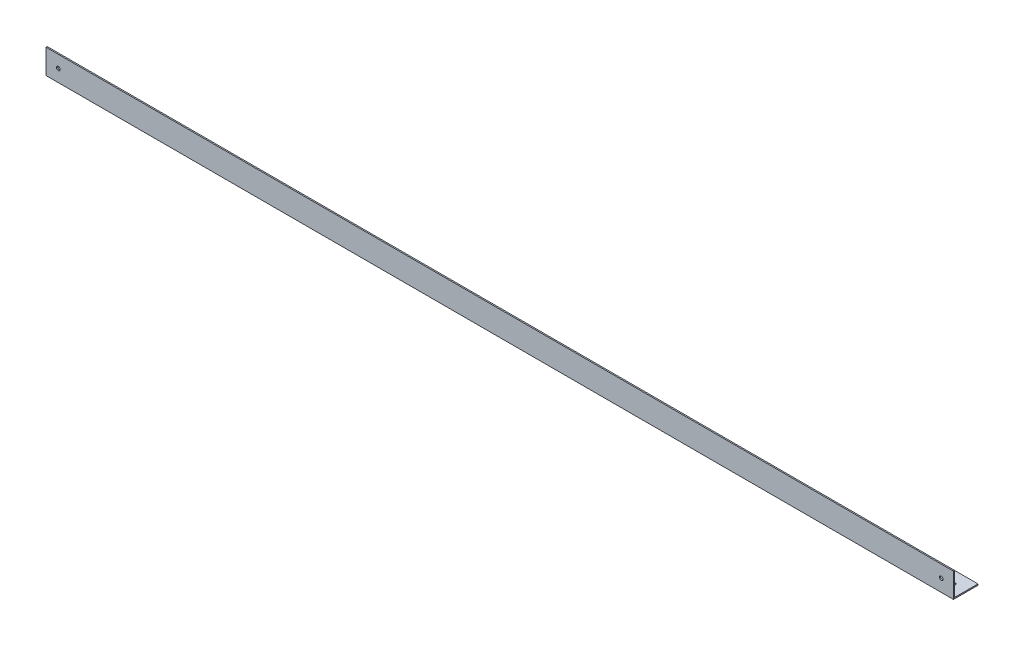
ISO-10303-21;
HEADER;
FILE_DESCRIPTION(('STEP AP214'),'2;1');
FILE_NAME('part.step','',(''),(''),'','','');
FILE_SCHEMA(('AUTOMOTIVE_DESIGN { 1 0 10303 214 1 1 1 1 }'));
ENDSEC;
DATA;
#1=APPLICATION_CONTEXT('core data for automotive mechanical design processes');
#2=APPLICATION_PROTOCOL_DEFINITION('international standard','automotive_design',2000,#1);
#3=PRODUCT_CONTEXT('',#1,'mechanical');
#4=PRODUCT('Part','Part','',(#3));
#5=PRODUCT_RELATED_PRODUCT_CATEGORY('part','',(#4));
#6=PRODUCT_DEFINITION_FORMATION('','',#4);
#7=PRODUCT_DEFINITION_CONTEXT('part definition',#1,'design');
#8=PRODUCT_DEFINITION('design','',#6,#7);
#9=PRODUCT_DEFINITION_SHAPE('','',#8);
#10=(LENGTH_UNIT() NAMED_UNIT(*) SI_UNIT(.MILLI.,.METRE.));
#11=(NAMED_UNIT(*) PLANE_ANGLE_UNIT() SI_UNIT($,.RADIAN.));
#12=(NAMED_UNIT(*) SI_UNIT($,.STERADIAN.) SOLID_ANGLE_UNIT());
#13=UNCERTAINTY_MEASURE_WITH_UNIT(LENGTH_MEASURE(1.E-05),#10,'distance_accuracy_value','');
#14=(GEOMETRIC_REPRESENTATION_CONTEXT(3) GLOBAL_UNCERTAINTY_ASSIGNED_CONTEXT((#13)) GLOBAL_UNIT_ASSIGNED_CONTEXT((#10,
#11,#12)) REPRESENTATION_CONTEXT('',''));
#15=CARTESIAN_POINT('',(0.,0.,0.));
#16=DIRECTION('',(0.,0.,1.));
#17=DIRECTION('',(1.,0.,0.));
#18=AXIS2_PLACEMENT_3D('',#15,#16,#17);
#19=CARTESIAN_POINT('',(740.,0.,-20.));
#20=DIRECTION('',(0.,1.,0.));
#21=DIRECTION('',(0.,0.,1.));
#22=AXIS2_PLACEMENT_3D('',#19,#20,#21);
#23=PLANE('',#22);
#24=CARTESIAN_POINT('',(730.,0.,-10.));
#25=DIRECTION('',(0.,-1.,0.));
#26=DIRECTION('',(0.,0.,-1.));
#27=AXIS2_PLACEMENT_3D('',#24,#25,#26);
#28=CIRCLE('',#27,1.49999999999997);
#29=CARTESIAN_POINT('',(730.,0.,-11.5));
#30=VERTEX_POINT('',#29);
#31=EDGE_CURVE('E169',#30,#30,#28,.T.);
#32=ORIENTED_EDGE('',*,*,#31,.F.);
#33=EDGE_LOOP('',(#32));
#34=FACE_BOUND('',#33,.T.);
#35=CARTESIAN_POINT('',(10.,0.,-10.));
#36=DIRECTION('',(0.,-1.,0.));
#37=DIRECTION('',(0.,0.,-1.));
#38=AXIS2_PLACEMENT_3D('',#35,#36,#37);
#39=CIRCLE('',#38,1.5);
#40=CARTESIAN_POINT('',(10.,0.,-11.5));
#41=VERTEX_POINT('',#40);
#42=EDGE_CURVE('E172',#41,#41,#39,.T.);
#43=ORIENTED_EDGE('',*,*,#42,.F.);
#44=EDGE_LOOP('',(#43));
#45=FACE_BOUND('',#44,.T.);
#46=DIRECTION('',(0.,0.,-1.));
#47=VECTOR('',#46,1.);
#48=CARTESIAN_POINT('',(0.,0.,-20.));
#49=LINE('',#48,#47);
#50=CARTESIAN_POINT('',(0.,0.,0.));
#51=VERTEX_POINT('',#50);
#52=CARTESIAN_POINT('',(0.,0.,-20.));
#53=VERTEX_POINT('',#52);
#54=EDGE_CURVE('E119',#51,#53,#49,.T.);
#55=ORIENTED_EDGE('',*,*,#54,.T.);
#56=DIRECTION('',(-1.,0.,0.));
#57=VECTOR('',#56,1.);
#58=CARTESIAN_POINT('',(740.,0.,-20.));
#59=LINE('',#58,#57);
#60=CARTESIAN_POINT('',(740.,0.,-20.));
#61=VERTEX_POINT('',#60);
#62=EDGE_CURVE('E11',#61,#53,#59,.T.);
#63=ORIENTED_EDGE('',*,*,#62,.F.);
#64=DIRECTION('',(0.,0.,-1.));
#65=VECTOR('',#64,1.);
#66=CARTESIAN_POINT('',(740.,0.,-20.));
#67=LINE('',#66,#65);
#68=CARTESIAN_POINT('',(740.,0.,0.));
#69=VERTEX_POINT('',#68);
#70=EDGE_CURVE('E130',#69,#61,#67,.T.);
#71=ORIENTED_EDGE('',*,*,#70,.F.);
#72=DIRECTION('',(-1.,0.,0.));
#73=VECTOR('',#72,1.);
#74=CARTESIAN_POINT('',(740.,0.,0.));
#75=LINE('',#74,#73);
#76=EDGE_CURVE('E115',#69,#51,#75,.T.);
#77=ORIENTED_EDGE('',*,*,#76,.T.);
#78=EDGE_LOOP('',(#55,#63,#71,#77));
#79=FACE_BOUND('',#78,.T.);
#80=ADVANCED_FACE('F35',(#34,#45,#79),#23,.F.);
#81=CARTESIAN_POINT('',(740.,0.999999999999998,-20.));
#82=DIRECTION('',(0.,0.,1.));
#83=DIRECTION('',(0.,-1.,0.));
#84=AXIS2_PLACEMENT_3D('',#81,#82,#83);
#85=PLANE('',#84);
#86=DIRECTION('',(0.,1.,0.));
#87=VECTOR('',#86,1.);
#88=CARTESIAN_POINT('',(0.,0.999999999999998,-20.));
#89=LINE('',#88,#87);
#90=CARTESIAN_POINT('',(0.,0.999999999999998,-20.));
#91=VERTEX_POINT('',#90);
#92=EDGE_CURVE('E122',#53,#91,#89,.T.);
#93=ORIENTED_EDGE('',*,*,#92,.T.);
#94=DIRECTION('',(-1.,0.,0.));
#95=VECTOR('',#94,1.);
#96=CARTESIAN_POINT('',(740.,0.999999999999998,-20.));
#97=LINE('',#96,#95);
#98=CARTESIAN_POINT('',(740.,0.999999999999998,-20.));
#99=VERTEX_POINT('',#98);
#100=EDGE_CURVE('E43',#99,#91,#97,.T.);
#101=ORIENTED_EDGE('',*,*,#100,.F.);
#102=DIRECTION('',(0.,1.,0.));
#103=VECTOR('',#102,1.);
#104=CARTESIAN_POINT('',(740.,0.999999999999998,-20.));
#105=LINE('',#104,#103);
#106=EDGE_CURVE('E88',#61,#99,#105,.T.);
#107=ORIENTED_EDGE('',*,*,#106,.F.);
#108=ORIENTED_EDGE('',*,*,#62,.T.);
#109=EDGE_LOOP('',(#93,#101,#107,#108));
#110=FACE_BOUND('',#109,.T.);
#111=ADVANCED_FACE('F159',(#110),#85,.F.);
#112=CARTESIAN_POINT('',(740.,0.999999999999997,-1.));
#113=DIRECTION('',(0.,-1.,0.));
#114=DIRECTION('',(0.,0.,-1.));
#115=AXIS2_PLACEMENT_3D('',#112,#113,#114);
#116=PLANE('',#115);
#117=CARTESIAN_POINT('',(730.,0.999999999999997,-10.));
#118=DIRECTION('',(0.,-1.,0.));
#119=DIRECTION('',(0.,0.,-1.));
#120=AXIS2_PLACEMENT_3D('',#117,#118,#119);
#121=CIRCLE('',#120,1.49999999999997);
#122=CARTESIAN_POINT('',(730.,0.999999999999997,-11.5));
#123=VERTEX_POINT('',#122);
#124=EDGE_CURVE('E175',#123,#123,#121,.F.);
#125=ORIENTED_EDGE('',*,*,#124,.F.);
#126=EDGE_LOOP('',(#125));
#127=FACE_BOUND('',#126,.T.);
#128=CARTESIAN_POINT('',(10.,0.999999999999997,-10.));
#129=DIRECTION('',(0.,-1.,0.));
#130=DIRECTION('',(0.,0.,-1.));
#131=AXIS2_PLACEMENT_3D('',#128,#129,#130);
#132=CIRCLE('',#131,1.5);
#133=CARTESIAN_POINT('',(10.,0.999999999999997,-11.5));
#134=VERTEX_POINT('',#133);
#135=EDGE_CURVE('E174',#134,#134,#132,.F.);
#136=ORIENTED_EDGE('',*,*,#135,.F.);
#137=EDGE_LOOP('',(#136));
#138=FACE_BOUND('',#137,.T.);
#139=DIRECTION('',(0.,0.,1.));
#140=VECTOR('',#139,1.);
#141=CARTESIAN_POINT('',(0.,0.999999999999997,-1.));
#142=LINE('',#141,#140);
#143=CARTESIAN_POINT('',(0.,0.999999999999997,-1.));
#144=VERTEX_POINT('',#143);
#145=EDGE_CURVE('E125',#91,#144,#142,.T.);
#146=ORIENTED_EDGE('',*,*,#145,.T.);
#147=DIRECTION('',(-1.,0.,0.));
#148=VECTOR('',#147,1.);
#149=CARTESIAN_POINT('',(740.,0.999999999999997,-1.));
#150=LINE('',#149,#148);
#151=CARTESIAN_POINT('',(740.,0.999999999999997,-1.));
#152=VERTEX_POINT('',#151);
#153=EDGE_CURVE('E110',#152,#144,#150,.T.);
#154=ORIENTED_EDGE('',*,*,#153,.F.);
#155=DIRECTION('',(0.,0.,1.));
#156=VECTOR('',#155,1.);
#157=CARTESIAN_POINT('',(740.,0.999999999999997,-1.));
#158=LINE('',#157,#156);
#159=EDGE_CURVE('E101',#99,#152,#158,.T.);
#160=ORIENTED_EDGE('',*,*,#159,.F.);
#161=ORIENTED_EDGE('',*,*,#100,.T.);
#162=EDGE_LOOP('',(#146,#154,#160,#161));
#163=FACE_BOUND('',#162,.T.);
#164=ADVANCED_FACE('F136',(#127,#138,#163),#116,.F.);
#165=CARTESIAN_POINT('',(740.,20.,-0.999999999999998));
#166=DIRECTION('',(0.,0.,1.));
#167=DIRECTION('',(0.,-1.,0.));
#168=AXIS2_PLACEMENT_3D('',#165,#166,#167);
#169=PLANE('',#168);
#170=CARTESIAN_POINT('',(730.,10.,-0.999999999999997));
#171=DIRECTION('',(0.,0.,1.));
#172=DIRECTION('',(0.,-1.,0.));
#173=AXIS2_PLACEMENT_3D('',#170,#171,#172);
#174=CIRCLE('',#173,1.49999999999997);
#175=CARTESIAN_POINT('',(731.5,10.,-0.999999999999997));
#176=VERTEX_POINT('',#175);
#177=EDGE_CURVE('E186',#176,#176,#174,.F.);
#178=ORIENTED_EDGE('',*,*,#177,.F.);
#179=EDGE_LOOP('',(#178));
#180=FACE_BOUND('',#179,.T.);
#181=CARTESIAN_POINT('',(10.,10.,-0.999999999999997));
#182=DIRECTION('',(0.,0.,1.));
#183=DIRECTION('',(0.,-1.,0.));
#184=AXIS2_PLACEMENT_3D('',#181,#182,#183);
#185=CIRCLE('',#184,1.5);
#186=CARTESIAN_POINT('',(11.5,10.,-0.999999999999997));
#187=VERTEX_POINT('',#186);
#188=EDGE_CURVE('E123',#187,#187,#185,.F.);
#189=ORIENTED_EDGE('',*,*,#188,.F.);
#190=EDGE_LOOP('',(#189));
#191=FACE_BOUND('',#190,.T.);
#192=DIRECTION('',(0.,1.,0.));
#193=VECTOR('',#192,1.);
#194=CARTESIAN_POINT('',(0.,20.,-0.999999999999998));
#195=LINE('',#194,#193);
#196=CARTESIAN_POINT('',(0.,20.,-0.999999999999998));
#197=VERTEX_POINT('',#196);
#198=EDGE_CURVE('E109',#144,#197,#195,.T.);
#199=ORIENTED_EDGE('',*,*,#198,.T.);
#200=DIRECTION('',(-1.,0.,0.));
#201=VECTOR('',#200,1.);
#202=CARTESIAN_POINT('',(740.,20.,-0.999999999999998));
#203=LINE('',#202,#201);
#204=CARTESIAN_POINT('',(740.,20.,-0.999999999999998));
#205=VERTEX_POINT('',#204);
#206=EDGE_CURVE('E106',#205,#197,#203,.T.);
#207=ORIENTED_EDGE('',*,*,#206,.F.);
#208=DIRECTION('',(0.,1.,0.));
#209=VECTOR('',#208,1.);
#210=CARTESIAN_POINT('',(740.,20.,-0.999999999999998));
#211=LINE('',#210,#209);
#212=EDGE_CURVE('E95',#152,#205,#211,.T.);
#213=ORIENTED_EDGE('',*,*,#212,.F.);
#214=ORIENTED_EDGE('',*,*,#153,.T.);
#215=EDGE_LOOP('',(#199,#207,#213,#214));
#216=FACE_BOUND('',#215,.T.);
#217=ADVANCED_FACE('F107',(#180,#191,#216),#169,.F.);
#218=CARTESIAN_POINT('',(740.,20.,0.));
#219=DIRECTION('',(0.,-1.,0.));
#220=DIRECTION('',(0.,0.,-1.));
#221=AXIS2_PLACEMENT_3D('',#218,#219,#220);
#222=PLANE('',#221);
#223=DIRECTION('',(0.,0.,1.));
#224=VECTOR('',#223,1.);
#225=CARTESIAN_POINT('',(0.,20.,0.));
#226=LINE('',#225,#224);
#227=CARTESIAN_POINT('',(0.,20.,0.));
#228=VERTEX_POINT('',#227);
#229=EDGE_CURVE('E74',#197,#228,#226,.T.);
#230=ORIENTED_EDGE('',*,*,#229,.T.);
#231=DIRECTION('',(-1.,0.,0.));
#232=VECTOR('',#231,1.);
#233=CARTESIAN_POINT('',(740.,20.,0.));
#234=LINE('',#233,#232);
#235=CARTESIAN_POINT('',(740.,20.,0.));
#236=VERTEX_POINT('',#235);
#237=EDGE_CURVE('E111',#236,#228,#234,.T.);
#238=ORIENTED_EDGE('',*,*,#237,.F.);
#239=DIRECTION('',(0.,0.,1.));
#240=VECTOR('',#239,1.);
#241=CARTESIAN_POINT('',(740.,20.,0.));
#242=LINE('',#241,#240);
#243=EDGE_CURVE('E99',#205,#236,#242,.T.);
#244=ORIENTED_EDGE('',*,*,#243,.F.);
#245=ORIENTED_EDGE('',*,*,#206,.T.);
#246=EDGE_LOOP('',(#230,#238,#244,#245));
#247=FACE_BOUND('',#246,.T.);
#248=ADVANCED_FACE('F113',(#247),#222,.F.);
#249=CARTESIAN_POINT('',(740.,0.,0.));
#250=DIRECTION('',(0.,0.,-1.));
#251=DIRECTION('',(-1.,0.,0.));
#252=AXIS2_PLACEMENT_3D('',#249,#250,#251);
#253=PLANE('',#252);
#254=CARTESIAN_POINT('',(730.,10.,0.));
#255=DIRECTION('',(0.,0.,1.));
#256=DIRECTION('',(1.,0.,0.));
#257=AXIS2_PLACEMENT_3D('',#254,#255,#256);
#258=CIRCLE('',#257,1.49999999999997);
#259=CARTESIAN_POINT('',(731.5,10.,0.));
#260=VERTEX_POINT('',#259);
#261=EDGE_CURVE('E178',#260,#260,#258,.T.);
#262=ORIENTED_EDGE('',*,*,#261,.F.);
#263=EDGE_LOOP('',(#262));
#264=FACE_BOUND('',#263,.T.);
#265=CARTESIAN_POINT('',(10.,10.,0.));
#266=DIRECTION('',(0.,0.,1.));
#267=DIRECTION('',(1.,0.,0.));
#268=AXIS2_PLACEMENT_3D('',#265,#266,#267);
#269=CIRCLE('',#268,1.5);
#270=CARTESIAN_POINT('',(11.5,10.,0.));
#271=VERTEX_POINT('',#270);
#272=EDGE_CURVE('E189',#271,#271,#269,.T.);
#273=ORIENTED_EDGE('',*,*,#272,.F.);
#274=EDGE_LOOP('',(#273));
#275=FACE_BOUND('',#274,.T.);
#276=DIRECTION('',(0.,-1.,0.));
#277=VECTOR('',#276,1.);
#278=CARTESIAN_POINT('',(0.,0.,0.));
#279=LINE('',#278,#277);
#280=EDGE_CURVE('E80',#228,#51,#279,.T.);
#281=ORIENTED_EDGE('',*,*,#280,.T.);
#282=ORIENTED_EDGE('',*,*,#76,.F.);
#283=DIRECTION('',(0.,-1.,0.));
#284=VECTOR('',#283,1.);
#285=CARTESIAN_POINT('',(740.,0.,0.));
#286=LINE('',#285,#284);
#287=EDGE_CURVE('E51',#236,#69,#286,.T.);
#288=ORIENTED_EDGE('',*,*,#287,.F.);
#289=ORIENTED_EDGE('',*,*,#237,.T.);
#290=EDGE_LOOP('',(#281,#282,#288,#289));
#291=FACE_BOUND('',#290,.T.);
#292=ADVANCED_FACE('F143',(#264,#275,#291),#253,.F.);
#293=CARTESIAN_POINT('',(740.,0.,0.));
#294=DIRECTION('',(-1.,0.,0.));
#295=DIRECTION('',(0.,0.,1.));
#296=AXIS2_PLACEMENT_3D('',#293,#294,#295);
#297=PLANE('',#296);
#298=ORIENTED_EDGE('',*,*,#70,.T.);
#299=ORIENTED_EDGE('',*,*,#106,.T.);
#300=ORIENTED_EDGE('',*,*,#159,.T.);
#301=ORIENTED_EDGE('',*,*,#212,.T.);
#302=ORIENTED_EDGE('',*,*,#243,.T.);
#303=ORIENTED_EDGE('',*,*,#287,.T.);
#304=EDGE_LOOP('',(#298,#299,#300,#301,#302,#303));
#305=FACE_BOUND('',#304,.T.);
#306=ADVANCED_FACE('F97',(#305),#297,.F.);
#307=CARTESIAN_POINT('',(0.,0.,0.));
#308=DIRECTION('',(-1.,0.,0.));
#309=DIRECTION('',(0.,0.,1.));
#310=AXIS2_PLACEMENT_3D('',#307,#308,#309);
#311=PLANE('',#310);
#312=ORIENTED_EDGE('',*,*,#54,.F.);
#313=ORIENTED_EDGE('',*,*,#280,.F.);
#314=ORIENTED_EDGE('',*,*,#229,.F.);
#315=ORIENTED_EDGE('',*,*,#198,.F.);
#316=ORIENTED_EDGE('',*,*,#145,.F.);
#317=ORIENTED_EDGE('',*,*,#92,.F.);
#318=EDGE_LOOP('',(#312,#313,#314,#315,#316,#317));
#319=FACE_BOUND('',#318,.T.);
#320=ADVANCED_FACE('F139',(#319),#311,.T.);
#321=CARTESIAN_POINT('',(10.,10.,-20.001));
#322=DIRECTION('',(0.,0.,1.));
#323=DIRECTION('',(1.,0.,0.));
#324=AXIS2_PLACEMENT_3D('',#321,#322,#323);
#325=CYLINDRICAL_SURFACE('',#324,1.5);
#326=CARTESIAN_POINT('',(11.5,10.,0.));
#327=CARTESIAN_POINT('',(11.5,10.,-0.0104166666666701));
#328=CARTESIAN_POINT('',(11.5,10.,-0.0208333333333368));
#329=CARTESIAN_POINT('',(11.5,10.,-0.0416666666666702));
#330=CARTESIAN_POINT('',(11.5,10.,-0.0520833333333369));
#331=CARTESIAN_POINT('',(11.5,10.,-0.0729166666666702));
#332=CARTESIAN_POINT('',(11.5,10.,-0.0833333333333369));
#333=CARTESIAN_POINT('',(11.5,10.,-0.10416666666667));
#334=CARTESIAN_POINT('',(11.5,10.,-0.114583333333337));
#335=CARTESIAN_POINT('',(11.5,10.,-0.13541666666667));
#336=CARTESIAN_POINT('',(11.5,10.,-0.145833333333337));
#337=CARTESIAN_POINT('',(11.5,10.,-0.16666666666667));
#338=CARTESIAN_POINT('',(11.5,10.,-0.177083333333337));
#339=CARTESIAN_POINT('',(11.5,10.,-0.19791666666667));
#340=CARTESIAN_POINT('',(11.5,10.,-0.208333333333337));
#341=CARTESIAN_POINT('',(11.5,10.,-0.22916666666667));
#342=CARTESIAN_POINT('',(11.5,10.,-0.239583333333337));
#343=CARTESIAN_POINT('',(11.5,10.,-0.260416666666669));
#344=CARTESIAN_POINT('',(11.5,10.,-0.270833333333335));
#345=CARTESIAN_POINT('',(11.5,10.,-0.291666666666667));
#346=CARTESIAN_POINT('',(11.5,10.,-0.302083333333334));
#347=CARTESIAN_POINT('',(11.5,10.,-0.322916666666667));
#348=CARTESIAN_POINT('',(11.5,10.,-0.333333333333334));
#349=CARTESIAN_POINT('',(11.5,10.,-0.354166666666667));
#350=CARTESIAN_POINT('',(11.5,10.,-0.364583333333334));
#351=CARTESIAN_POINT('',(11.5,10.,-0.385416666666667));
#352=CARTESIAN_POINT('',(11.5,10.,-0.395833333333334));
#353=CARTESIAN_POINT('',(11.5,10.,-0.416666666666667));
#354=CARTESIAN_POINT('',(11.5,10.,-0.427083333333334));
#355=CARTESIAN_POINT('',(11.5,10.,-0.447916666666667));
#356=CARTESIAN_POINT('',(11.5,10.,-0.458333333333334));
#357=CARTESIAN_POINT('',(11.5,10.,-0.479166666666667));
#358=CARTESIAN_POINT('',(11.5,10.,-0.489583333333334));
#359=CARTESIAN_POINT('',(11.5,10.,-0.510416666666667));
#360=CARTESIAN_POINT('',(11.5,10.,-0.520833333333334));
#361=CARTESIAN_POINT('',(11.5,10.,-0.541666666666667));
#362=CARTESIAN_POINT('',(11.5,10.,-0.552083333333334));
#363=CARTESIAN_POINT('',(11.5,10.,-0.572916666666667));
#364=CARTESIAN_POINT('',(11.5,10.,-0.583333333333334));
#365=CARTESIAN_POINT('',(11.5,10.,-0.604166666666667));
#366=CARTESIAN_POINT('',(11.5,10.,-0.614583333333334));
#367=CARTESIAN_POINT('',(11.5,10.,-0.635416666666667));
#368=CARTESIAN_POINT('',(11.5,10.,-0.645833333333334));
#369=CARTESIAN_POINT('',(11.5,10.,-0.666666666666667));
#370=CARTESIAN_POINT('',(11.5,10.,-0.677083333333334));
#371=CARTESIAN_POINT('',(11.5,10.,-0.697916666666667));
#372=CARTESIAN_POINT('',(11.5,10.,-0.708333333333334));
#373=CARTESIAN_POINT('',(11.5,10.,-0.729166666666666));
#374=CARTESIAN_POINT('',(11.5,10.,-0.739583333333332));
#375=CARTESIAN_POINT('',(11.5,10.,-0.760416666666664));
#376=CARTESIAN_POINT('',(11.5,10.,-0.77083333333333));
#377=CARTESIAN_POINT('',(11.5,10.,-0.791666666666664));
#378=CARTESIAN_POINT('',(11.5,10.,-0.802083333333331));
#379=CARTESIAN_POINT('',(11.5,10.,-0.822916666666664));
#380=CARTESIAN_POINT('',(11.5,10.,-0.833333333333331));
#381=CARTESIAN_POINT('',(11.5,10.,-0.854166666666664));
#382=CARTESIAN_POINT('',(11.5,10.,-0.864583333333331));
#383=CARTESIAN_POINT('',(11.5,10.,-0.885416666666664));
#384=CARTESIAN_POINT('',(11.5,10.,-0.895833333333331));
#385=CARTESIAN_POINT('',(11.5,10.,-0.916666666666664));
#386=CARTESIAN_POINT('',(11.5,10.,-0.927083333333331));
#387=CARTESIAN_POINT('',(11.5,10.,-0.947916666666664));
#388=CARTESIAN_POINT('',(11.5,10.,-0.958333333333331));
#389=CARTESIAN_POINT('',(11.5,10.,-0.979166666666664));
#390=CARTESIAN_POINT('',(11.5,10.,-0.989583333333331));
#391=CARTESIAN_POINT('',(11.5,10.,-0.999999999999997));
#392=B_SPLINE_CURVE_WITH_KNOTS('',3,(#326,#327,#328,#329,#330,#331,#332,#333,#334,#335,#336,
#337,#338,#339,#340,#341,#342,#343,#344,#345,#346,#347,#348,#349,#350,#351,#352,#353,#354,#355,
#356,#357,#358,#359,#360,#361,#362,#363,#364,#365,#366,#367,#368,#369,#370,#371,#372,#373,#374,
#375,#376,#377,#378,#379,#380,#381,#382,#383,#384,#385,#386,#387,#388,#389,#390,#391),
.UNSPECIFIED.,.F.,.F.,(4,2,2,2,2,2,2,2,2,2,2,2,2,2,2,2,2,2,2,2,2,2,2,2,2,2,2,2,2,2,2,2,4),(0.,
0.03125,0.0625000000000001,0.0937500000000001,0.125,0.15625,0.1875,0.21875,0.25,
0.281249999999997,0.312499999999997,0.343749999999997,0.374999999999997,0.406249999999997,
0.437499999999997,0.468749999999997,0.499999999999997,0.531249999999997,0.562499999999997,
0.593749999999997,0.624999999999997,0.656249999999997,0.687499999999997,0.718749999999997,
0.749999999999994,0.781249999999994,0.812499999999994,0.843749999999994,0.874999999999994,
0.906249999999994,0.937499999999994,0.968749999999994,0.999999999999994),.UNSPECIFIED.);
#393=EDGE_CURVE('BSEAM197',#271,#187,#392,.T.);
#394=ORIENTED_EDGE('',*,*,#272,.T.);
#395=ORIENTED_EDGE('',*,*,#188,.T.);
#396=ORIENTED_EDGE('',*,*,#393,.T.);
#397=ORIENTED_EDGE('',*,*,#393,.F.);
#398=EDGE_LOOP('',(#394,#396,#395,#397));
#399=FACE_BOUND('',#398,.T.);
#400=ADVANCED_FACE('F197',(#399),#325,.F.);
#401=CARTESIAN_POINT('',(730.,10.,-20.001));
#402=DIRECTION('',(0.,0.,1.));
#403=DIRECTION('',(1.,0.,0.));
#404=AXIS2_PLACEMENT_3D('',#401,#402,#403);
#405=CYLINDRICAL_SURFACE('',#404,1.49999999999997);
#406=CARTESIAN_POINT('',(731.5,10.,0.));
#407=CARTESIAN_POINT('',(731.5,10.,-0.0104166666666701));
#408=CARTESIAN_POINT('',(731.5,10.,-0.0208333333333368));
#409=CARTESIAN_POINT('',(731.5,10.,-0.0416666666666702));
#410=CARTESIAN_POINT('',(731.5,10.,-0.0520833333333369));
#411=CARTESIAN_POINT('',(731.5,10.,-0.0729166666666702));
#412=CARTESIAN_POINT('',(731.5,10.,-0.0833333333333369));
#413=CARTESIAN_POINT('',(731.5,10.,-0.10416666666667));
#414=CARTESIAN_POINT('',(731.5,10.,-0.114583333333337));
#415=CARTESIAN_POINT('',(731.5,10.,-0.13541666666667));
#416=CARTESIAN_POINT('',(731.5,10.,-0.145833333333337));
#417=CARTESIAN_POINT('',(731.5,10.,-0.16666666666667));
#418=CARTESIAN_POINT('',(731.5,10.,-0.177083333333337));
#419=CARTESIAN_POINT('',(731.5,10.,-0.19791666666667));
#420=CARTESIAN_POINT('',(731.5,10.,-0.208333333333337));
#421=CARTESIAN_POINT('',(731.5,10.,-0.22916666666667));
#422=CARTESIAN_POINT('',(731.5,10.,-0.239583333333337));
#423=CARTESIAN_POINT('',(731.5,10.,-0.260416666666669));
#424=CARTESIAN_POINT('',(731.5,10.,-0.270833333333335));
#425=CARTESIAN_POINT('',(731.5,10.,-0.291666666666667));
#426=CARTESIAN_POINT('',(731.5,10.,-0.302083333333334));
#427=CARTESIAN_POINT('',(731.5,10.,-0.322916666666667));
#428=CARTESIAN_POINT('',(731.5,10.,-0.333333333333334));
#429=CARTESIAN_POINT('',(731.5,10.,-0.354166666666667));
#430=CARTESIAN_POINT('',(731.5,10.,-0.364583333333334));
#431=CARTESIAN_POINT('',(731.5,10.,-0.385416666666667));
#432=CARTESIAN_POINT('',(731.5,10.,-0.395833333333334));
#433=CARTESIAN_POINT('',(731.5,10.,-0.416666666666667));
#434=CARTESIAN_POINT('',(731.5,10.,-0.427083333333334));
#435=CARTESIAN_POINT('',(731.5,10.,-0.447916666666667));
#436=CARTESIAN_POINT('',(731.5,10.,-0.458333333333334));
#437=CARTESIAN_POINT('',(731.5,10.,-0.479166666666667));
#438=CARTESIAN_POINT('',(731.5,10.,-0.489583333333334));
#439=CARTESIAN_POINT('',(731.5,10.,-0.510416666666667));
#440=CARTESIAN_POINT('',(731.5,10.,-0.520833333333334));
#441=CARTESIAN_POINT('',(731.5,10.,-0.541666666666667));
#442=CARTESIAN_POINT('',(731.5,10.,-0.552083333333334));
#443=CARTESIAN_POINT('',(731.5,10.,-0.572916666666667));
#444=CARTESIAN_POINT('',(731.5,10.,-0.583333333333334));
#445=CARTESIAN_POINT('',(731.5,10.,-0.604166666666667));
#446=CARTESIAN_POINT('',(731.5,10.,-0.614583333333334));
#447=CARTESIAN_POINT('',(731.5,10.,-0.635416666666667));
#448=CARTESIAN_POINT('',(731.5,10.,-0.645833333333334));
#449=CARTESIAN_POINT('',(731.5,10.,-0.666666666666667));
#450=CARTESIAN_POINT('',(731.5,10.,-0.677083333333334));
#451=CARTESIAN_POINT('',(731.5,10.,-0.697916666666667));
#452=CARTESIAN_POINT('',(731.5,10.,-0.708333333333334));
#453=CARTESIAN_POINT('',(731.5,10.,-0.729166666666666));
#454=CARTESIAN_POINT('',(731.5,10.,-0.739583333333332));
#455=CARTESIAN_POINT('',(731.5,10.,-0.760416666666664));
#456=CARTESIAN_POINT('',(731.5,10.,-0.77083333333333));
#457=CARTESIAN_POINT('',(731.5,10.,-0.791666666666664));
#458=CARTESIAN_POINT('',(731.5,10.,-0.802083333333331));
#459=CARTESIAN_POINT('',(731.5,10.,-0.822916666666664));
#460=CARTESIAN_POINT('',(731.5,10.,-0.833333333333331));
#461=CARTESIAN_POINT('',(731.5,10.,-0.854166666666664));
#462=CARTESIAN_POINT('',(731.5,10.,-0.864583333333331));
#463=CARTESIAN_POINT('',(731.5,10.,-0.885416666666664));
#464=CARTESIAN_POINT('',(731.5,10.,-0.895833333333331));
#465=CARTESIAN_POINT('',(731.5,10.,-0.916666666666664));
#466=CARTESIAN_POINT('',(731.5,10.,-0.927083333333331));
#467=CARTESIAN_POINT('',(731.5,10.,-0.947916666666664));
#468=CARTESIAN_POINT('',(731.5,10.,-0.958333333333331));
#469=CARTESIAN_POINT('',(731.5,10.,-0.979166666666664));
#470=CARTESIAN_POINT('',(731.5,10.,-0.989583333333331));
#471=CARTESIAN_POINT('',(731.5,10.,-0.999999999999997));
#472=B_SPLINE_CURVE_WITH_KNOTS('',3,(#406,#407,#408,#409,#410,#411,#412,#413,#414,#415,#416,
#417,#418,#419,#420,#421,#422,#423,#424,#425,#426,#427,#428,#429,#430,#431,#432,#433,#434,#435,
#436,#437,#438,#439,#440,#441,#442,#443,#444,#445,#446,#447,#448,#449,#450,#451,#452,#453,#454,
#455,#456,#457,#458,#459,#460,#461,#462,#463,#464,#465,#466,#467,#468,#469,#470,#471),
.UNSPECIFIED.,.F.,.F.,(4,2,2,2,2,2,2,2,2,2,2,2,2,2,2,2,2,2,2,2,2,2,2,2,2,2,2,2,2,2,2,2,4),(0.,
0.03125,0.0625000000000001,0.0937500000000001,0.125,0.15625,0.1875,0.21875,0.25,
0.281249999999997,0.312499999999997,0.343749999999997,0.374999999999997,0.406249999999997,
0.437499999999997,0.468749999999997,0.499999999999997,0.531249999999997,0.562499999999997,
0.593749999999997,0.624999999999997,0.656249999999997,0.687499999999997,0.718749999999997,
0.749999999999994,0.781249999999994,0.812499999999994,0.843749999999994,0.874999999999994,
0.906249999999994,0.937499999999994,0.968749999999994,0.999999999999994),.UNSPECIFIED.);
#473=EDGE_CURVE('BSEAM208',#260,#176,#472,.T.);
#474=ORIENTED_EDGE('',*,*,#261,.T.);
#475=ORIENTED_EDGE('',*,*,#177,.T.);
#476=ORIENTED_EDGE('',*,*,#473,.T.);
#477=ORIENTED_EDGE('',*,*,#473,.F.);
#478=EDGE_LOOP('',(#474,#476,#475,#477));
#479=FACE_BOUND('',#478,.T.);
#480=ADVANCED_FACE('F208',(#479),#405,.F.);
#481=CARTESIAN_POINT('',(10.,20.001,-10.));
#482=DIRECTION('',(0.,-1.,0.));
#483=DIRECTION('',(0.,0.,-1.));
#484=AXIS2_PLACEMENT_3D('',#481,#482,#483);
#485=CYLINDRICAL_SURFACE('',#484,1.5);
#486=ORIENTED_EDGE('',*,*,#42,.T.);
#487=EDGE_LOOP('',(#486));
#488=FACE_BOUND('',#487,.T.);
#489=ORIENTED_EDGE('',*,*,#135,.T.);
#490=EDGE_LOOP('',(#489));
#491=FACE_BOUND('',#490,.T.);
#492=ADVANCED_FACE('F210',(#488,#491),#485,.F.);
#493=CARTESIAN_POINT('',(730.,20.001,-10.));
#494=DIRECTION('',(0.,-1.,0.));
#495=DIRECTION('',(0.,0.,-1.));
#496=AXIS2_PLACEMENT_3D('',#493,#494,#495);
#497=CYLINDRICAL_SURFACE('',#496,1.49999999999997);
#498=ORIENTED_EDGE('',*,*,#31,.T.);
#499=EDGE_LOOP('',(#498));
#500=FACE_BOUND('',#499,.T.);
#501=ORIENTED_EDGE('',*,*,#124,.T.);
#502=EDGE_LOOP('',(#501));
#503=FACE_BOUND('',#502,.T.);
#504=ADVANCED_FACE('F216',(#500,#503),#497,.F.);
#505=CLOSED_SHELL('',(#80,#111,#164,#217,#248,#292,#306,#320,#400,#480,#492,#504));
#506=MANIFOLD_SOLID_BREP('B2',#505);
#507=ADVANCED_BREP_SHAPE_REPRESENTATION('',(#18,#506),#14);
#508=SHAPE_DEFINITION_REPRESENTATION(#9,#507);
ENDSEC;
END-ISO-10303-21;
